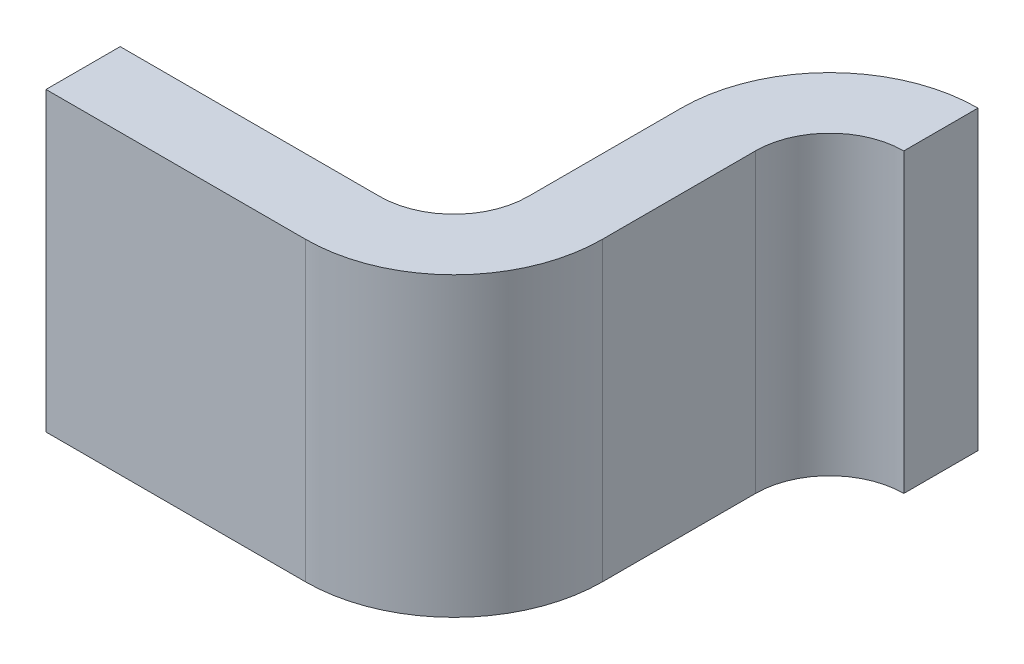
ISO-10303-21;
HEADER;
FILE_DESCRIPTION(('STEP AP214'),'2;1');
FILE_NAME('part.step','',(''),(''),'','','');
FILE_SCHEMA(('AUTOMOTIVE_DESIGN { 1 0 10303 214 1 1 1 1 }'));
ENDSEC;
DATA;
#1=APPLICATION_CONTEXT('core data for automotive mechanical design processes');
#2=APPLICATION_PROTOCOL_DEFINITION('international standard','automotive_design',2000,#1);
#3=PRODUCT_CONTEXT('',#1,'mechanical');
#4=PRODUCT('Part','Part','',(#3));
#5=PRODUCT_RELATED_PRODUCT_CATEGORY('part','',(#4));
#6=PRODUCT_DEFINITION_FORMATION('','',#4);
#7=PRODUCT_DEFINITION_CONTEXT('part definition',#1,'design');
#8=PRODUCT_DEFINITION('design','',#6,#7);
#9=PRODUCT_DEFINITION_SHAPE('','',#8);
#10=(LENGTH_UNIT() NAMED_UNIT(*) SI_UNIT(.MILLI.,.METRE.));
#11=(NAMED_UNIT(*) PLANE_ANGLE_UNIT() SI_UNIT($,.RADIAN.));
#12=(NAMED_UNIT(*) SI_UNIT($,.STERADIAN.) SOLID_ANGLE_UNIT());
#13=UNCERTAINTY_MEASURE_WITH_UNIT(LENGTH_MEASURE(1.E-05),#10,'distance_accuracy_value','');
#14=(GEOMETRIC_REPRESENTATION_CONTEXT(3) GLOBAL_UNCERTAINTY_ASSIGNED_CONTEXT((#13)) GLOBAL_UNIT_ASSIGNED_CONTEXT((#10,
#11,#12)) REPRESENTATION_CONTEXT('',''));
#15=CARTESIAN_POINT('',(0.,0.,0.));
#16=DIRECTION('',(0.,0.,1.));
#17=DIRECTION('',(1.,0.,0.));
#18=AXIS2_PLACEMENT_3D('',#15,#16,#17);
#19=CARTESIAN_POINT('',(0.65,0.2,0.2));
#20=DIRECTION('',(0.,-1.,0.));
#21=DIRECTION('',(0.,0.,-1.));
#22=AXIS2_PLACEMENT_3D('',#19,#20,#21);
#23=CYLINDRICAL_SURFACE('',#22,0.1);
#24=CARTESIAN_POINT('',(0.65,0.2,0.2));
#25=DIRECTION('',(0.,-1.,0.));
#26=DIRECTION('',(0.,0.,-1.));
#27=AXIS2_PLACEMENT_3D('',#24,#25,#26);
#28=CIRCLE('',#27,0.1);
#29=CARTESIAN_POINT('',(0.55,0.2,0.2));
#30=VERTEX_POINT('',#29);
#31=CARTESIAN_POINT('',(0.65,0.2,0.1));
#32=VERTEX_POINT('',#31);
#33=EDGE_CURVE('E20',#30,#32,#28,.T.);
#34=ORIENTED_EDGE('',*,*,#33,.F.);
#35=DIRECTION('',(0.,1.,0.));
#36=VECTOR('',#35,1.);
#37=CARTESIAN_POINT('',(0.55,0.2,0.2));
#38=LINE('',#37,#36);
#39=CARTESIAN_POINT('',(0.55,-0.2,0.2));
#40=VERTEX_POINT('',#39);
#41=EDGE_CURVE('E88',#30,#40,#38,.F.);
#42=ORIENTED_EDGE('',*,*,#41,.T.);
#43=CARTESIAN_POINT('',(0.65,-0.2,0.2));
#44=DIRECTION('',(0.,-1.,0.));
#45=DIRECTION('',(0.,0.,-1.));
#46=AXIS2_PLACEMENT_3D('',#43,#44,#45);
#47=CIRCLE('',#46,0.1);
#48=CARTESIAN_POINT('',(0.65,-0.2,0.1));
#49=VERTEX_POINT('',#48);
#50=EDGE_CURVE('E132',#49,#40,#47,.F.);
#51=ORIENTED_EDGE('',*,*,#50,.F.);
#52=DIRECTION('',(0.,1.,0.));
#53=VECTOR('',#52,1.);
#54=CARTESIAN_POINT('',(0.65,-0.2,0.1));
#55=LINE('',#54,#53);
#56=EDGE_CURVE('E111',#49,#32,#55,.T.);
#57=ORIENTED_EDGE('',*,*,#56,.T.);
#58=EDGE_LOOP('',(#34,#42,#51,#57));
#59=FACE_BOUND('',#58,.T.);
#60=ADVANCED_FACE('F17',(#59),#23,.F.);
#61=CARTESIAN_POINT('',(0.55,0.2,0.4065));
#62=DIRECTION('',(-1.,0.,0.));
#63=DIRECTION('',(0.,0.,1.));
#64=AXIS2_PLACEMENT_3D('',#61,#62,#63);
#65=PLANE('',#64);
#66=DIRECTION('',(0.,0.,-1.));
#67=VECTOR('',#66,1.);
#68=CARTESIAN_POINT('',(0.55,0.2,0.4065));
#69=LINE('',#68,#67);
#70=CARTESIAN_POINT('',(0.55,0.2,0.4065));
#71=VERTEX_POINT('',#70);
#72=EDGE_CURVE('E92',#30,#71,#69,.F.);
#73=ORIENTED_EDGE('',*,*,#72,.T.);
#74=DIRECTION('',(0.,1.,0.));
#75=VECTOR('',#74,1.);
#76=CARTESIAN_POINT('',(0.55,0.2,0.4065));
#77=LINE('',#76,#75);
#78=CARTESIAN_POINT('',(0.55,-0.2,0.4065));
#79=VERTEX_POINT('',#78);
#80=EDGE_CURVE('E108',#79,#71,#77,.T.);
#81=ORIENTED_EDGE('',*,*,#80,.F.);
#82=DIRECTION('',(0.,0.,1.));
#83=VECTOR('',#82,1.);
#84=CARTESIAN_POINT('',(0.55,-0.2,0.4065));
#85=LINE('',#84,#83);
#86=EDGE_CURVE('E93',#79,#40,#85,.F.);
#87=ORIENTED_EDGE('',*,*,#86,.T.);
#88=ORIENTED_EDGE('',*,*,#41,.F.);
#89=EDGE_LOOP('',(#73,#81,#87,#88));
#90=FACE_BOUND('',#89,.T.);
#91=ADVANCED_FACE('F90',(#90),#65,.F.);
#92=CARTESIAN_POINT('',(0.65,-0.2,0.));
#93=DIRECTION('',(-1.,0.,0.));
#94=DIRECTION('',(0.,0.,1.));
#95=AXIS2_PLACEMENT_3D('',#92,#93,#94);
#96=PLANE('',#95);
#97=DIRECTION('',(0.,0.,1.));
#98=VECTOR('',#97,1.);
#99=CARTESIAN_POINT('',(0.65,0.2,0.));
#100=LINE('',#99,#98);
#101=CARTESIAN_POINT('',(0.65,0.2,0.));
#102=VERTEX_POINT('',#101);
#103=EDGE_CURVE('E112',#32,#102,#100,.F.);
#104=ORIENTED_EDGE('',*,*,#103,.F.);
#105=ORIENTED_EDGE('',*,*,#56,.F.);
#106=DIRECTION('',(0.,0.,-1.));
#107=VECTOR('',#106,1.);
#108=CARTESIAN_POINT('',(0.65,-0.2,0.09393398282202));
#109=LINE('',#108,#107);
#110=CARTESIAN_POINT('',(0.65,-0.2,0.));
#111=VERTEX_POINT('',#110);
#112=EDGE_CURVE('E114',#111,#49,#109,.F.);
#113=ORIENTED_EDGE('',*,*,#112,.F.);
#114=DIRECTION('',(0.,-1.,0.));
#115=VECTOR('',#114,1.);
#116=CARTESIAN_POINT('',(0.65,-0.2,0.));
#117=LINE('',#116,#115);
#118=EDGE_CURVE('E130',#102,#111,#117,.T.);
#119=ORIENTED_EDGE('',*,*,#118,.F.);
#120=EDGE_LOOP('',(#104,#105,#113,#119));
#121=FACE_BOUND('',#120,.T.);
#122=ADVANCED_FACE('F148',(#121),#96,.F.);
#123=CARTESIAN_POINT('',(0.35,0.2,0.4065));
#124=DIRECTION('',(0.,1.,0.));
#125=DIRECTION('',(0.,0.,1.));
#126=AXIS2_PLACEMENT_3D('',#123,#124,#125);
#127=CYLINDRICAL_SURFACE('',#126,0.2);
#128=CARTESIAN_POINT('',(0.35,0.2,0.4065));
#129=DIRECTION('',(0.,1.,0.));
#130=DIRECTION('',(0.,0.,1.));
#131=AXIS2_PLACEMENT_3D('',#128,#129,#130);
#132=CIRCLE('',#131,0.2);
#133=CARTESIAN_POINT('',(0.35,0.2,0.6065));
#134=VERTEX_POINT('',#133);
#135=EDGE_CURVE('E107',#134,#71,#132,.T.);
#136=ORIENTED_EDGE('',*,*,#135,.F.);
#137=DIRECTION('',(0.,1.,0.));
#138=VECTOR('',#137,1.);
#139=CARTESIAN_POINT('',(0.35,0.2,0.6065));
#140=LINE('',#139,#138);
#141=CARTESIAN_POINT('',(0.35,-0.2,0.6065));
#142=VERTEX_POINT('',#141);
#143=EDGE_CURVE('E127',#134,#142,#140,.F.);
#144=ORIENTED_EDGE('',*,*,#143,.T.);
#145=CARTESIAN_POINT('',(0.35,-0.2,0.4065));
#146=DIRECTION('',(0.,1.,0.));
#147=DIRECTION('',(0.,0.,1.));
#148=AXIS2_PLACEMENT_3D('',#145,#146,#147);
#149=CIRCLE('',#148,0.2);
#150=EDGE_CURVE('E123',#79,#142,#149,.F.);
#151=ORIENTED_EDGE('',*,*,#150,.F.);
#152=ORIENTED_EDGE('',*,*,#80,.T.);
#153=EDGE_LOOP('',(#136,#144,#151,#152));
#154=FACE_BOUND('',#153,.T.);
#155=ADVANCED_FACE('F211',(#154),#127,.T.);
#156=CARTESIAN_POINT('',(0.65,-0.2,0.2));
#157=DIRECTION('',(0.,-1.,0.));
#158=DIRECTION('',(0.,0.,-1.));
#159=AXIS2_PLACEMENT_3D('',#156,#157,#158);
#160=CYLINDRICAL_SURFACE('',#159,0.2);
#161=CARTESIAN_POINT('',(0.65,-0.2,0.2));
#162=DIRECTION('',(0.,-1.,0.));
#163=DIRECTION('',(0.,0.,-1.));
#164=AXIS2_PLACEMENT_3D('',#161,#162,#163);
#165=CIRCLE('',#164,0.2);
#166=CARTESIAN_POINT('',(0.45,-0.2,0.2));
#167=VERTEX_POINT('',#166);
#168=EDGE_CURVE('E128',#111,#167,#165,.F.);
#169=ORIENTED_EDGE('',*,*,#168,.T.);
#170=DIRECTION('',(0.,1.,0.));
#171=VECTOR('',#170,1.);
#172=CARTESIAN_POINT('',(0.45,-0.2,0.2));
#173=LINE('',#172,#171);
#174=CARTESIAN_POINT('',(0.45,0.2,0.2));
#175=VERTEX_POINT('',#174);
#176=EDGE_CURVE('E156',#167,#175,#173,.T.);
#177=ORIENTED_EDGE('',*,*,#176,.T.);
#178=CARTESIAN_POINT('',(0.65,0.2,0.2));
#179=DIRECTION('',(0.,-1.,0.));
#180=DIRECTION('',(0.,0.,-1.));
#181=AXIS2_PLACEMENT_3D('',#178,#179,#180);
#182=CIRCLE('',#181,0.2);
#183=EDGE_CURVE('E131',#175,#102,#182,.T.);
#184=ORIENTED_EDGE('',*,*,#183,.T.);
#185=ORIENTED_EDGE('',*,*,#118,.T.);
#186=EDGE_LOOP('',(#169,#177,#184,#185));
#187=FACE_BOUND('',#186,.T.);
#188=ADVANCED_FACE('F143',(#187),#160,.T.);
#189=CARTESIAN_POINT('',(0.,0.2,0.6065));
#190=DIRECTION('',(0.,0.,-1.));
#191=DIRECTION('',(-1.,0.,0.));
#192=AXIS2_PLACEMENT_3D('',#189,#190,#191);
#193=PLANE('',#192);
#194=DIRECTION('',(1.,0.,0.));
#195=VECTOR('',#194,1.);
#196=CARTESIAN_POINT('',(0.,0.2,0.6065));
#197=LINE('',#196,#195);
#198=CARTESIAN_POINT('',(0.,0.2,0.6065));
#199=VERTEX_POINT('',#198);
#200=EDGE_CURVE('E158',#134,#199,#197,.F.);
#201=ORIENTED_EDGE('',*,*,#200,.T.);
#202=DIRECTION('',(0.,1.,0.));
#203=VECTOR('',#202,1.);
#204=CARTESIAN_POINT('',(0.,-0.2,0.6065));
#205=LINE('',#204,#203);
#206=CARTESIAN_POINT('',(0.,-0.2,0.6065));
#207=VERTEX_POINT('',#206);
#208=EDGE_CURVE('E180',#207,#199,#205,.T.);
#209=ORIENTED_EDGE('',*,*,#208,.F.);
#210=DIRECTION('',(1.,0.,0.));
#211=VECTOR('',#210,1.);
#212=CARTESIAN_POINT('',(0.,-0.2,0.6065));
#213=LINE('',#212,#211);
#214=EDGE_CURVE('E122',#207,#142,#213,.T.);
#215=ORIENTED_EDGE('',*,*,#214,.T.);
#216=ORIENTED_EDGE('',*,*,#143,.F.);
#217=EDGE_LOOP('',(#201,#209,#215,#216));
#218=FACE_BOUND('',#217,.T.);
#219=ADVANCED_FACE('F209',(#218),#193,.F.);
#220=CARTESIAN_POINT('',(0.45,-0.2,0.4065));
#221=DIRECTION('',(1.,0.,0.));
#222=DIRECTION('',(0.,0.,-1.));
#223=AXIS2_PLACEMENT_3D('',#220,#221,#222);
#224=PLANE('',#223);
#225=DIRECTION('',(0.,0.,-1.));
#226=VECTOR('',#225,1.);
#227=CARTESIAN_POINT('',(0.45,-0.2,0.4065));
#228=LINE('',#227,#226);
#229=CARTESIAN_POINT('',(0.45,-0.2,0.4065));
#230=VERTEX_POINT('',#229);
#231=EDGE_CURVE('E152',#230,#167,#228,.T.);
#232=ORIENTED_EDGE('',*,*,#231,.F.);
#233=DIRECTION('',(0.,1.,0.));
#234=VECTOR('',#233,1.);
#235=CARTESIAN_POINT('',(0.45,-0.2,0.4065));
#236=LINE('',#235,#234);
#237=CARTESIAN_POINT('',(0.45,0.2,0.4065));
#238=VERTEX_POINT('',#237);
#239=EDGE_CURVE('E118',#230,#238,#236,.T.);
#240=ORIENTED_EDGE('',*,*,#239,.T.);
#241=DIRECTION('',(0.,0.,-1.));
#242=VECTOR('',#241,1.);
#243=CARTESIAN_POINT('',(0.45,0.2,0.4065));
#244=LINE('',#243,#242);
#245=EDGE_CURVE('E125',#175,#238,#244,.F.);
#246=ORIENTED_EDGE('',*,*,#245,.F.);
#247=ORIENTED_EDGE('',*,*,#176,.F.);
#248=EDGE_LOOP('',(#232,#240,#246,#247));
#249=FACE_BOUND('',#248,.T.);
#250=ADVANCED_FACE('F235',(#249),#224,.F.);
#251=CARTESIAN_POINT('',(0.,0.2,0.5065));
#252=DIRECTION('',(0.,-1.,0.));
#253=DIRECTION('',(0.,0.,-1.));
#254=AXIS2_PLACEMENT_3D('',#251,#252,#253);
#255=PLANE('',#254);
#256=DIRECTION('',(1.,0.,0.));
#257=VECTOR('',#256,1.);
#258=CARTESIAN_POINT('',(0.,0.2,0.5065));
#259=LINE('',#258,#257);
#260=CARTESIAN_POINT('',(0.35,0.2,0.5065));
#261=VERTEX_POINT('',#260);
#262=CARTESIAN_POINT('',(0.,0.2,0.5065));
#263=VERTEX_POINT('',#262);
#264=EDGE_CURVE('E165',#261,#263,#259,.F.);
#265=ORIENTED_EDGE('',*,*,#264,.T.);
#266=DIRECTION('',(0.,0.,1.));
#267=VECTOR('',#266,1.);
#268=CARTESIAN_POINT('',(0.,0.2,0.5065));
#269=LINE('',#268,#267);
#270=EDGE_CURVE('E177',#199,#263,#269,.F.);
#271=ORIENTED_EDGE('',*,*,#270,.F.);
#272=ORIENTED_EDGE('',*,*,#200,.F.);
#273=ORIENTED_EDGE('',*,*,#135,.T.);
#274=ORIENTED_EDGE('',*,*,#72,.F.);
#275=ORIENTED_EDGE('',*,*,#33,.T.);
#276=ORIENTED_EDGE('',*,*,#103,.T.);
#277=ORIENTED_EDGE('',*,*,#183,.F.);
#278=ORIENTED_EDGE('',*,*,#245,.T.);
#279=CARTESIAN_POINT('',(0.35,0.2,0.4065));
#280=DIRECTION('',(0.,1.,0.));
#281=DIRECTION('',(0.,0.,1.));
#282=AXIS2_PLACEMENT_3D('',#279,#280,#281);
#283=CIRCLE('',#282,0.1);
#284=EDGE_CURVE('E119',#238,#261,#283,.F.);
#285=ORIENTED_EDGE('',*,*,#284,.T.);
#286=EDGE_LOOP('',(#265,#271,#272,#273,#274,#275,#276,#277,#278,#285));
#287=FACE_BOUND('',#286,.T.);
#288=ADVANCED_FACE('F102',(#287),#255,.F.);
#289=CARTESIAN_POINT('',(0.,-0.2,0.5065));
#290=DIRECTION('',(-1.,0.,0.));
#291=DIRECTION('',(0.,0.,1.));
#292=AXIS2_PLACEMENT_3D('',#289,#290,#291);
#293=PLANE('',#292);
#294=ORIENTED_EDGE('',*,*,#270,.T.);
#295=DIRECTION('',(0.,1.,0.));
#296=VECTOR('',#295,1.);
#297=CARTESIAN_POINT('',(0.,-0.2,0.5065));
#298=LINE('',#297,#296);
#299=CARTESIAN_POINT('',(0.,-0.2,0.5065));
#300=VERTEX_POINT('',#299);
#301=EDGE_CURVE('E167',#263,#300,#298,.F.);
#302=ORIENTED_EDGE('',*,*,#301,.T.);
#303=DIRECTION('',(0.,0.,1.));
#304=VECTOR('',#303,1.);
#305=CARTESIAN_POINT('',(0.,-0.2,0.6065));
#306=LINE('',#305,#304);
#307=EDGE_CURVE('E170',#300,#207,#306,.T.);
#308=ORIENTED_EDGE('',*,*,#307,.T.);
#309=ORIENTED_EDGE('',*,*,#208,.T.);
#310=EDGE_LOOP('',(#294,#302,#308,#309));
#311=FACE_BOUND('',#310,.T.);
#312=ADVANCED_FACE('F199',(#311),#293,.T.);
#313=CARTESIAN_POINT('',(0.,-0.2,0.6065));
#314=DIRECTION('',(0.,1.,0.));
#315=DIRECTION('',(0.,0.,1.));
#316=AXIS2_PLACEMENT_3D('',#313,#314,#315);
#317=PLANE('',#316);
#318=ORIENTED_EDGE('',*,*,#214,.F.);
#319=ORIENTED_EDGE('',*,*,#307,.F.);
#320=DIRECTION('',(1.,0.,0.));
#321=VECTOR('',#320,1.);
#322=CARTESIAN_POINT('',(0.,-0.2,0.5065));
#323=LINE('',#322,#321);
#324=CARTESIAN_POINT('',(0.35,-0.2,0.5065));
#325=VERTEX_POINT('',#324);
#326=EDGE_CURVE('E26',#300,#325,#323,.T.);
#327=ORIENTED_EDGE('',*,*,#326,.T.);
#328=CARTESIAN_POINT('',(0.35,-0.2,0.4065));
#329=DIRECTION('',(0.,1.,0.));
#330=DIRECTION('',(0.,0.,1.));
#331=AXIS2_PLACEMENT_3D('',#328,#329,#330);
#332=CIRCLE('',#331,0.1);
#333=EDGE_CURVE('E34',#325,#230,#332,.T.);
#334=ORIENTED_EDGE('',*,*,#333,.T.);
#335=ORIENTED_EDGE('',*,*,#231,.T.);
#336=ORIENTED_EDGE('',*,*,#168,.F.);
#337=ORIENTED_EDGE('',*,*,#112,.T.);
#338=ORIENTED_EDGE('',*,*,#50,.T.);
#339=ORIENTED_EDGE('',*,*,#86,.F.);
#340=ORIENTED_EDGE('',*,*,#150,.T.);
#341=EDGE_LOOP('',(#318,#319,#327,#334,#335,#336,#337,#338,#339,#340));
#342=FACE_BOUND('',#341,.T.);
#343=ADVANCED_FACE('F151',(#342),#317,.F.);
#344=CARTESIAN_POINT('',(0.35,-0.2,0.4065));
#345=DIRECTION('',(0.,1.,0.));
#346=DIRECTION('',(0.,0.,1.));
#347=AXIS2_PLACEMENT_3D('',#344,#345,#346);
#348=CYLINDRICAL_SURFACE('',#347,0.1);
#349=ORIENTED_EDGE('',*,*,#333,.F.);
#350=DIRECTION('',(0.,1.,0.));
#351=VECTOR('',#350,1.);
#352=CARTESIAN_POINT('',(0.35,-0.2,0.5065));
#353=LINE('',#352,#351);
#354=EDGE_CURVE('E11',#325,#261,#353,.T.);
#355=ORIENTED_EDGE('',*,*,#354,.T.);
#356=ORIENTED_EDGE('',*,*,#284,.F.);
#357=ORIENTED_EDGE('',*,*,#239,.F.);
#358=EDGE_LOOP('',(#349,#355,#356,#357));
#359=FACE_BOUND('',#358,.T.);
#360=ADVANCED_FACE('F205',(#359),#348,.F.);
#361=CARTESIAN_POINT('',(0.,-0.2,0.5065));
#362=DIRECTION('',(0.,0.,1.));
#363=DIRECTION('',(1.,0.,0.));
#364=AXIS2_PLACEMENT_3D('',#361,#362,#363);
#365=PLANE('',#364);
#366=ORIENTED_EDGE('',*,*,#326,.F.);
#367=ORIENTED_EDGE('',*,*,#301,.F.);
#368=ORIENTED_EDGE('',*,*,#264,.F.);
#369=ORIENTED_EDGE('',*,*,#354,.F.);
#370=EDGE_LOOP('',(#366,#367,#368,#369));
#371=FACE_BOUND('',#370,.T.);
#372=ADVANCED_FACE('F204',(#371),#365,.F.);
#373=CLOSED_SHELL('',(#60,#91,#122,#155,#188,#219,#250,#288,#312,#343,#360,#372));
#374=MANIFOLD_SOLID_BREP('B1',#373);
#375=ADVANCED_BREP_SHAPE_REPRESENTATION('',(#18,#374),#14);
#376=SHAPE_DEFINITION_REPRESENTATION(#9,#375);
ENDSEC;
END-ISO-10303-21;
